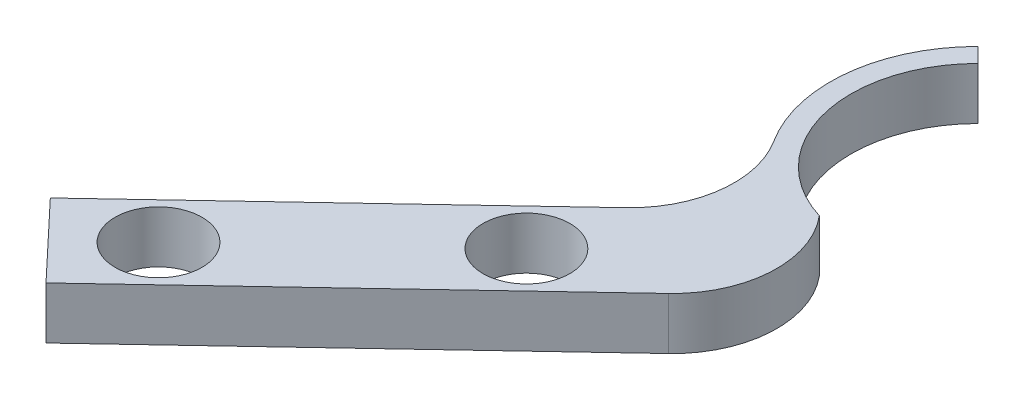
ISO-10303-21;
HEADER;
FILE_DESCRIPTION(('STEP AP214'),'2;1');
FILE_NAME('part.step','',(''),(''),'','','');
FILE_SCHEMA(('AUTOMOTIVE_DESIGN { 1 0 10303 214 1 1 1 1 }'));
ENDSEC;
DATA;
#1=APPLICATION_CONTEXT('core data for automotive mechanical design processes');
#2=APPLICATION_PROTOCOL_DEFINITION('international standard','automotive_design',2000,#1);
#3=PRODUCT_CONTEXT('',#1,'mechanical');
#4=PRODUCT('Part','Part','',(#3));
#5=PRODUCT_RELATED_PRODUCT_CATEGORY('part','',(#4));
#6=PRODUCT_DEFINITION_FORMATION('','',#4);
#7=PRODUCT_DEFINITION_CONTEXT('part definition',#1,'design');
#8=PRODUCT_DEFINITION('design','',#6,#7);
#9=PRODUCT_DEFINITION_SHAPE('','',#8);
#10=(LENGTH_UNIT() NAMED_UNIT(*) SI_UNIT(.MILLI.,.METRE.));
#11=(NAMED_UNIT(*) PLANE_ANGLE_UNIT() SI_UNIT($,.RADIAN.));
#12=(NAMED_UNIT(*) SI_UNIT($,.STERADIAN.) SOLID_ANGLE_UNIT());
#13=UNCERTAINTY_MEASURE_WITH_UNIT(LENGTH_MEASURE(1.E-05),#10,'distance_accuracy_value','');
#14=(GEOMETRIC_REPRESENTATION_CONTEXT(3) GLOBAL_UNCERTAINTY_ASSIGNED_CONTEXT((#13)) GLOBAL_UNIT_ASSIGNED_CONTEXT((#10,
#11,#12)) REPRESENTATION_CONTEXT('',''));
#15=CARTESIAN_POINT('',(0.,0.,0.));
#16=DIRECTION('',(0.,0.,1.));
#17=DIRECTION('',(1.,0.,0.));
#18=AXIS2_PLACEMENT_3D('',#15,#16,#17);
#19=CARTESIAN_POINT('',(3.43031500119851,5.,3.6377106801603));
#20=DIRECTION('',(0.686063000239704,0.,0.727542136032062));
#21=DIRECTION('',(0.727542136032062,0.,-0.686063000239704));
#22=AXIS2_PLACEMENT_3D('',#19,#20,#21);
#23=PLANE('',#22);
#24=DIRECTION('',(-0.727542136032062,0.,0.686063000239704));
#25=VECTOR('',#24,1.);
#26=CARTESIAN_POINT('',(3.43031500119851,0.,3.6377106801603));
#27=LINE('',#26,#25);
#28=CARTESIAN_POINT('',(16.0920880265322,0.,-8.30218057822283));
#29=VERTEX_POINT('',#28);
#30=CARTESIAN_POINT('',(-14.6765178286593,0.,20.7122242249587));
#31=VERTEX_POINT('',#30);
#32=EDGE_CURVE('E191',#29,#31,#27,.T.);
#33=ORIENTED_EDGE('',*,*,#32,.F.);
#34=DIRECTION('',(0.,1.,0.));
#35=VECTOR('',#34,1.);
#36=CARTESIAN_POINT('',(16.0920880265322,5.,-8.30218057822283));
#37=LINE('',#36,#35);
#38=CARTESIAN_POINT('',(16.0920880265322,5.,-8.30218057822283));
#39=VERTEX_POINT('',#38);
#40=EDGE_CURVE('E120',#29,#39,#37,.T.);
#41=ORIENTED_EDGE('',*,*,#40,.T.);
#42=DIRECTION('',(-0.727542136032062,0.,0.686063000239704));
#43=VECTOR('',#42,1.);
#44=CARTESIAN_POINT('',(3.43031500119851,5.,3.6377106801603));
#45=LINE('',#44,#43);
#46=CARTESIAN_POINT('',(-14.6765178286593,5.,20.7122242249587));
#47=VERTEX_POINT('',#46);
#48=EDGE_CURVE('E114',#39,#47,#45,.T.);
#49=ORIENTED_EDGE('',*,*,#48,.T.);
#50=DIRECTION('',(0.,-1.,0.));
#51=VECTOR('',#50,1.);
#52=CARTESIAN_POINT('',(-14.6765178286593,5.,20.7122242249587));
#53=LINE('',#52,#51);
#54=EDGE_CURVE('E178',#47,#31,#53,.T.);
#55=ORIENTED_EDGE('',*,*,#54,.T.);
#56=EDGE_LOOP('',(#33,#41,#49,#55));
#57=FACE_BOUND('',#56,.T.);
#58=ADVANCED_FACE('F41',(#57),#23,.T.);
#59=CARTESIAN_POINT('',(20.4562148991737,5.,-33.6827716988664));
#60=DIRECTION('',(0.,-1.,0.));
#61=DIRECTION('',(0.,0.,-1.));
#62=AXIS2_PLACEMENT_3D('',#59,#60,#61);
#63=CYLINDRICAL_SURFACE('',#62,12.1999999999932);
#64=CARTESIAN_POINT('',(20.4562148991737,0.,-33.6827716988664));
#65=DIRECTION('',(0.,1.,0.));
#66=DIRECTION('',(0.,0.,1.));
#67=AXIS2_PLACEMENT_3D('',#64,#65,#66);
#68=CIRCLE('',#67,12.1999999999932);
#69=CARTESIAN_POINT('',(11.8295121687064,0.,-42.3094744293412));
#70=VERTEX_POINT('',#69);
#71=CARTESIAN_POINT('',(16.8810685137953,0.,-22.0183673710431));
#72=VERTEX_POINT('',#71);
#73=EDGE_CURVE('E194',#70,#72,#68,.T.);
#74=ORIENTED_EDGE('',*,*,#73,.F.);
#75=DIRECTION('',(0.,-1.,0.));
#76=VECTOR('',#75,1.);
#77=CARTESIAN_POINT('',(11.8295121687064,5.,-42.3094744293412));
#78=LINE('',#77,#76);
#79=CARTESIAN_POINT('',(11.8295121687064,5.,-42.3094744293412));
#80=VERTEX_POINT('',#79);
#81=EDGE_CURVE('E128',#80,#70,#78,.T.);
#82=ORIENTED_EDGE('',*,*,#81,.F.);
#83=CARTESIAN_POINT('',(20.4562148991737,5.,-33.6827716988664));
#84=DIRECTION('',(0.,1.,0.));
#85=DIRECTION('',(0.,0.,1.));
#86=AXIS2_PLACEMENT_3D('',#83,#84,#85);
#87=CIRCLE('',#86,12.1999999999932);
#88=CARTESIAN_POINT('',(16.8810685137953,5.,-22.0183673710431));
#89=VERTEX_POINT('',#88);
#90=EDGE_CURVE('E111',#80,#89,#87,.T.);
#91=ORIENTED_EDGE('',*,*,#90,.T.);
#92=DIRECTION('',(0.,-1.,0.));
#93=VECTOR('',#92,1.);
#94=CARTESIAN_POINT('',(16.8810685137953,5.,-22.0183673710431));
#95=LINE('',#94,#93);
#96=EDGE_CURVE('E126',#89,#72,#95,.T.);
#97=ORIENTED_EDGE('',*,*,#96,.T.);
#98=EDGE_LOOP('',(#74,#82,#91,#97));
#99=FACE_BOUND('',#98,.T.);
#100=ADVANCED_FACE('F125',(#99),#63,.F.);
#101=CARTESIAN_POINT('',(27.0694932990238,5.,-27.0694932990236));
#102=DIRECTION('',(0.707106781186551,0.,-0.707106781186544));
#103=DIRECTION('',(-0.707106781186544,0.,-0.707106781186551));
#104=AXIS2_PLACEMENT_3D('',#101,#102,#103);
#105=PLANE('',#104);
#106=DIRECTION('',(0.707106781186544,0.,0.707106781186551));
#107=VECTOR('',#106,1.);
#108=CARTESIAN_POINT('',(27.0694932990238,0.,-27.0694932990236));
#109=LINE('',#108,#107);
#110=CARTESIAN_POINT('',(10.4152986063247,0.,-43.7236879917228));
#111=VERTEX_POINT('',#110);
#112=EDGE_CURVE('E163',#111,#70,#109,.T.);
#113=ORIENTED_EDGE('',*,*,#112,.F.);
#114=DIRECTION('',(0.,-1.,0.));
#115=VECTOR('',#114,1.);
#116=CARTESIAN_POINT('',(10.4152986063247,5.,-43.7236879917228));
#117=LINE('',#116,#115);
#118=CARTESIAN_POINT('',(10.4152986063247,5.,-43.7236879917228));
#119=VERTEX_POINT('',#118);
#120=EDGE_CURVE('E139',#119,#111,#117,.T.);
#121=ORIENTED_EDGE('',*,*,#120,.F.);
#122=DIRECTION('',(0.707106781186544,0.,0.707106781186551));
#123=VECTOR('',#122,1.);
#124=CARTESIAN_POINT('',(27.0694932990238,5.,-27.0694932990236));
#125=LINE('',#124,#123);
#126=EDGE_CURVE('E130',#119,#80,#125,.T.);
#127=ORIENTED_EDGE('',*,*,#126,.T.);
#128=ORIENTED_EDGE('',*,*,#81,.T.);
#129=EDGE_LOOP('',(#113,#121,#127,#128));
#130=FACE_BOUND('',#129,.T.);
#131=ADVANCED_FACE('F225',(#130),#105,.T.);
#132=CARTESIAN_POINT('',(20.4562148991737,5.,-33.6827716988664));
#133=DIRECTION('',(0.,-1.,0.));
#134=DIRECTION('',(0.,0.,-1.));
#135=AXIS2_PLACEMENT_3D('',#132,#133,#134);
#136=CYLINDRICAL_SURFACE('',#135,14.1999999999932);
#137=CARTESIAN_POINT('',(20.4562148991737,0.,-33.6827716988664));
#138=DIRECTION('',(0.,1.,0.));
#139=DIRECTION('',(0.,0.,1.));
#140=AXIS2_PLACEMENT_3D('',#137,#138,#139);
#141=CIRCLE('',#140,14.1999999999932);
#142=CARTESIAN_POINT('',(8.48455297478388,0.,-26.0460635881736));
#143=VERTEX_POINT('',#142);
#144=EDGE_CURVE('E155',#111,#143,#141,.T.);
#145=ORIENTED_EDGE('',*,*,#144,.T.);
#146=DIRECTION('',(0.,-1.,0.));
#147=VECTOR('',#146,1.);
#148=CARTESIAN_POINT('',(8.48455297478387,5.,-26.0460635881736));
#149=LINE('',#148,#147);
#150=CARTESIAN_POINT('',(8.48455297478388,5.,-26.0460635881736));
#151=VERTEX_POINT('',#150);
#152=EDGE_CURVE('E63',#143,#151,#149,.F.);
#153=ORIENTED_EDGE('',*,*,#152,.T.);
#154=CARTESIAN_POINT('',(20.4562148991737,5.,-33.6827716988664));
#155=DIRECTION('',(0.,1.,0.));
#156=DIRECTION('',(0.,0.,1.));
#157=AXIS2_PLACEMENT_3D('',#154,#155,#156);
#158=CIRCLE('',#157,14.1999999999932);
#159=EDGE_CURVE('E174',#119,#151,#158,.T.);
#160=ORIENTED_EDGE('',*,*,#159,.F.);
#161=ORIENTED_EDGE('',*,*,#120,.T.);
#162=EDGE_LOOP('',(#145,#153,#160,#161));
#163=FACE_BOUND('',#162,.T.);
#164=ADVANCED_FACE('F161',(#163),#136,.T.);
#165=CARTESIAN_POINT('',(-3.43031500119852,5.,-3.63771068016031));
#166=DIRECTION('',(0.686063000239704,0.,0.727542136032063));
#167=DIRECTION('',(0.727542136032063,0.,-0.686063000239704));
#168=AXIS2_PLACEMENT_3D('',#165,#166,#167);
#169=PLANE('',#168);
#170=DIRECTION('',(-0.727542136032063,0.,0.686063000239704));
#171=VECTOR('',#170,1.);
#172=CARTESIAN_POINT('',(-3.43031500119852,5.,-3.63771068016031));
#173=LINE('',#172,#171);
#174=CARTESIAN_POINT('',(6.91443514309952,5.,-13.392678769616));
#175=VERTEX_POINT('',#174);
#176=CARTESIAN_POINT('',(-21.5371478310563,5.,13.4368028646381));
#177=VERTEX_POINT('',#176);
#178=EDGE_CURVE('E168',#175,#177,#173,.T.);
#179=ORIENTED_EDGE('',*,*,#178,.F.);
#180=DIRECTION('',(0.,1.,0.));
#181=VECTOR('',#180,1.);
#182=CARTESIAN_POINT('',(6.91443514309952,0.,-13.392678769616));
#183=LINE('',#182,#181);
#184=CARTESIAN_POINT('',(6.91443514309952,0.,-13.392678769616));
#185=VERTEX_POINT('',#184);
#186=EDGE_CURVE('E119',#175,#185,#183,.F.);
#187=ORIENTED_EDGE('',*,*,#186,.T.);
#188=DIRECTION('',(-0.727542136032063,0.,0.686063000239704));
#189=VECTOR('',#188,1.);
#190=CARTESIAN_POINT('',(-3.43031500119852,0.,-3.63771068016031));
#191=LINE('',#190,#189);
#192=CARTESIAN_POINT('',(-21.5371478310563,0.,13.4368028646381));
#193=VERTEX_POINT('',#192);
#194=EDGE_CURVE('E158',#185,#193,#191,.T.);
#195=ORIENTED_EDGE('',*,*,#194,.T.);
#196=DIRECTION('',(0.,-1.,0.));
#197=VECTOR('',#196,1.);
#198=CARTESIAN_POINT('',(-21.5371478310563,5.,13.4368028646381));
#199=LINE('',#198,#197);
#200=EDGE_CURVE('E170',#177,#193,#199,.T.);
#201=ORIENTED_EDGE('',*,*,#200,.F.);
#202=EDGE_LOOP('',(#179,#187,#195,#201));
#203=FACE_BOUND('',#202,.T.);
#204=ADVANCED_FACE('F166',(#203),#169,.F.);
#205=CARTESIAN_POINT('',(-12.6502668096173,5.,11.9290410430006));
#206=DIRECTION('',(0.,-1.,0.));
#207=DIRECTION('',(0.,0.,-1.));
#208=AXIS2_PLACEMENT_3D('',#205,#206,#207);
#209=CYLINDRICAL_SURFACE('',#208,4.17500000000002);
#210=CARTESIAN_POINT('',(-12.6502668096173,5.,11.9290410430006));
#211=DIRECTION('',(0.,1.,0.));
#212=DIRECTION('',(0.,0.,1.));
#213=AXIS2_PLACEMENT_3D('',#210,#211,#212);
#214=CIRCLE('',#213,4.17500000000002);
#215=CARTESIAN_POINT('',(-12.6502668096173,5.,16.1040410430006));
#216=VERTEX_POINT('',#215);
#217=EDGE_CURVE('E217',#216,#216,#214,.T.);
#218=ORIENTED_EDGE('',*,*,#217,.T.);
#219=EDGE_LOOP('',(#218));
#220=FACE_BOUND('',#219,.T.);
#221=CARTESIAN_POINT('',(-12.6502668096173,0.,11.9290410430006));
#222=DIRECTION('',(0.,1.,0.));
#223=DIRECTION('',(0.,0.,1.));
#224=AXIS2_PLACEMENT_3D('',#221,#222,#223);
#225=CIRCLE('',#224,4.17500000000002);
#226=CARTESIAN_POINT('',(-12.6502668096173,0.,16.1040410430006));
#227=VERTEX_POINT('',#226);
#228=EDGE_CURVE('E187',#227,#227,#225,.T.);
#229=ORIENTED_EDGE('',*,*,#228,.F.);
#230=EDGE_LOOP('',(#229));
#231=FACE_BOUND('',#230,.T.);
#232=ADVANCED_FACE('F239',(#220,#231),#209,.F.);
#233=CARTESIAN_POINT('',(5.53828659118425,5.,-5.22253396299199));
#234=DIRECTION('',(0.,-1.,0.));
#235=DIRECTION('',(0.,0.,-1.));
#236=AXIS2_PLACEMENT_3D('',#233,#234,#235);
#237=CYLINDRICAL_SURFACE('',#236,4.17500000000002);
#238=CARTESIAN_POINT('',(5.53828659118425,5.,-5.22253396299199));
#239=DIRECTION('',(0.,1.,0.));
#240=DIRECTION('',(0.,0.,1.));
#241=AXIS2_PLACEMENT_3D('',#238,#239,#240);
#242=CIRCLE('',#241,4.17500000000002);
#243=CARTESIAN_POINT('',(5.53828659118425,5.,-1.04753396299197));
#244=VERTEX_POINT('',#243);
#245=EDGE_CURVE('E205',#244,#244,#242,.T.);
#246=ORIENTED_EDGE('',*,*,#245,.T.);
#247=EDGE_LOOP('',(#246));
#248=FACE_BOUND('',#247,.T.);
#249=CARTESIAN_POINT('',(5.53828659118425,0.,-5.22253396299199));
#250=DIRECTION('',(0.,1.,0.));
#251=DIRECTION('',(0.,0.,1.));
#252=AXIS2_PLACEMENT_3D('',#249,#250,#251);
#253=CIRCLE('',#252,4.17500000000002);
#254=CARTESIAN_POINT('',(5.53828659118425,0.,-1.04753396299197));
#255=VERTEX_POINT('',#254);
#256=EDGE_CURVE('E183',#255,#255,#253,.T.);
#257=ORIENTED_EDGE('',*,*,#256,.F.);
#258=EDGE_LOOP('',(#257));
#259=FACE_BOUND('',#258,.T.);
#260=ADVANCED_FACE('F242',(#248,#259),#237,.F.);
#261=CARTESIAN_POINT('',(-18.1068328298578,5.,17.0745135447983));
#262=DIRECTION('',(0.727542136032065,0.,-0.686063000239702));
#263=DIRECTION('',(-0.686063000239702,0.,-0.727542136032065));
#264=AXIS2_PLACEMENT_3D('',#261,#262,#263);
#265=PLANE('',#264);
#266=DIRECTION('',(0.686063000239702,0.,0.727542136032065));
#267=VECTOR('',#266,1.);
#268=CARTESIAN_POINT('',(-18.1068328298578,0.,17.0745135447983));
#269=LINE('',#268,#267);
#270=EDGE_CURVE('E201',#193,#31,#269,.T.);
#271=ORIENTED_EDGE('',*,*,#270,.T.);
#272=ORIENTED_EDGE('',*,*,#54,.F.);
#273=DIRECTION('',(0.686063000239702,0.,0.727542136032065));
#274=VECTOR('',#273,1.);
#275=CARTESIAN_POINT('',(-18.1068328298578,5.,17.0745135447983));
#276=LINE('',#275,#274);
#277=EDGE_CURVE('E173',#177,#47,#276,.T.);
#278=ORIENTED_EDGE('',*,*,#277,.F.);
#279=ORIENTED_EDGE('',*,*,#200,.T.);
#280=EDGE_LOOP('',(#271,#272,#278,#279));
#281=FACE_BOUND('',#280,.T.);
#282=ADVANCED_FACE('F212',(#281),#265,.F.);
#283=CARTESIAN_POINT('',(0.,5.,0.));
#284=DIRECTION('',(0.,1.,0.));
#285=DIRECTION('',(0.,0.,1.));
#286=AXIS2_PLACEMENT_3D('',#283,#284,#285);
#287=PLANE('',#286);
#288=ORIENTED_EDGE('',*,*,#245,.F.);
#289=EDGE_LOOP('',(#288));
#290=FACE_BOUND('',#289,.T.);
#291=ORIENTED_EDGE('',*,*,#217,.F.);
#292=EDGE_LOOP('',(#291));
#293=FACE_BOUND('',#292,.T.);
#294=ORIENTED_EDGE('',*,*,#48,.F.);
#295=CARTESIAN_POINT('',(9.2314580241352,5.,-15.5776019385435));
#296=DIRECTION('',(0.,1.,0.));
#297=DIRECTION('',(0.,0.,1.));
#298=AXIS2_PLACEMENT_3D('',#295,#296,#297);
#299=CIRCLE('',#298,10.);
#300=EDGE_CURVE('E107',#39,#89,#299,.T.);
#301=ORIENTED_EDGE('',*,*,#300,.T.);
#302=ORIENTED_EDGE('',*,*,#90,.F.);
#303=ORIENTED_EDGE('',*,*,#126,.F.);
#304=ORIENTED_EDGE('',*,*,#159,.T.);
#305=CARTESIAN_POINT('',(0.053805140702478,5.,-20.6681001299367));
#306=DIRECTION('',(0.,1.,0.));
#307=DIRECTION('',(0.,0.,1.));
#308=AXIS2_PLACEMENT_3D('',#305,#306,#307);
#309=CIRCLE('',#308,10.);
#310=EDGE_CURVE('E11',#151,#175,#309,.F.);
#311=ORIENTED_EDGE('',*,*,#310,.T.);
#312=ORIENTED_EDGE('',*,*,#178,.T.);
#313=ORIENTED_EDGE('',*,*,#277,.T.);
#314=EDGE_LOOP('',(#294,#301,#302,#303,#304,#311,#312,#313));
#315=FACE_BOUND('',#314,.T.);
#316=ADVANCED_FACE('F109',(#290,#293,#315),#287,.T.);
#317=CARTESIAN_POINT('',(0.,0.,0.));
#318=DIRECTION('',(0.,1.,0.));
#319=DIRECTION('',(0.,0.,1.));
#320=AXIS2_PLACEMENT_3D('',#317,#318,#319);
#321=PLANE('',#320);
#322=ORIENTED_EDGE('',*,*,#256,.T.);
#323=EDGE_LOOP('',(#322));
#324=FACE_BOUND('',#323,.T.);
#325=ORIENTED_EDGE('',*,*,#228,.T.);
#326=EDGE_LOOP('',(#325));
#327=FACE_BOUND('',#326,.T.);
#328=ORIENTED_EDGE('',*,*,#73,.T.);
#329=CARTESIAN_POINT('',(9.2314580241352,0.,-15.5776019385435));
#330=DIRECTION('',(0.,1.,0.));
#331=DIRECTION('',(0.,0.,1.));
#332=AXIS2_PLACEMENT_3D('',#329,#330,#331);
#333=CIRCLE('',#332,10.);
#334=EDGE_CURVE('E133',#72,#29,#333,.F.);
#335=ORIENTED_EDGE('',*,*,#334,.T.);
#336=ORIENTED_EDGE('',*,*,#32,.T.);
#337=ORIENTED_EDGE('',*,*,#270,.F.);
#338=ORIENTED_EDGE('',*,*,#194,.F.);
#339=CARTESIAN_POINT('',(0.053805140702478,0.,-20.6681001299367));
#340=DIRECTION('',(0.,1.,0.));
#341=DIRECTION('',(0.,0.,1.));
#342=AXIS2_PLACEMENT_3D('',#339,#340,#341);
#343=CIRCLE('',#342,10.);
#344=EDGE_CURVE('E50',#185,#143,#343,.T.);
#345=ORIENTED_EDGE('',*,*,#344,.T.);
#346=ORIENTED_EDGE('',*,*,#144,.F.);
#347=ORIENTED_EDGE('',*,*,#112,.T.);
#348=EDGE_LOOP('',(#328,#335,#336,#337,#338,#345,#346,#347));
#349=FACE_BOUND('',#348,.T.);
#350=ADVANCED_FACE('F153',(#324,#327,#349),#321,.F.);
#351=CARTESIAN_POINT('',(9.2314580241352,5.,-15.5776019385435));
#352=DIRECTION('',(0.,-1.,0.));
#353=DIRECTION('',(0.,0.,-1.));
#354=AXIS2_PLACEMENT_3D('',#351,#352,#353);
#355=CYLINDRICAL_SURFACE('',#354,10.);
#356=ORIENTED_EDGE('',*,*,#300,.F.);
#357=ORIENTED_EDGE('',*,*,#40,.F.);
#358=ORIENTED_EDGE('',*,*,#334,.F.);
#359=ORIENTED_EDGE('',*,*,#96,.F.);
#360=EDGE_LOOP('',(#356,#357,#358,#359));
#361=FACE_BOUND('',#360,.T.);
#362=ADVANCED_FACE('F132',(#361),#355,.T.);
#363=CARTESIAN_POINT('',(0.053805140702478,5.,-20.6681001299367));
#364=DIRECTION('',(0.,-1.,0.));
#365=DIRECTION('',(0.,0.,-1.));
#366=AXIS2_PLACEMENT_3D('',#363,#364,#365);
#367=CYLINDRICAL_SURFACE('',#366,10.);
#368=ORIENTED_EDGE('',*,*,#310,.F.);
#369=ORIENTED_EDGE('',*,*,#152,.F.);
#370=ORIENTED_EDGE('',*,*,#344,.F.);
#371=ORIENTED_EDGE('',*,*,#186,.F.);
#372=EDGE_LOOP('',(#368,#369,#370,#371));
#373=FACE_BOUND('',#372,.T.);
#374=ADVANCED_FACE('F43',(#373),#367,.F.);
#375=CLOSED_SHELL('',(#58,#100,#131,#164,#204,#232,#260,#282,#316,#350,#362,#374));
#376=MANIFOLD_SOLID_BREP('B2',#375);
#377=ADVANCED_BREP_SHAPE_REPRESENTATION('',(#18,#376),#14);
#378=SHAPE_DEFINITION_REPRESENTATION(#9,#377);
ENDSEC;
END-ISO-10303-21;
